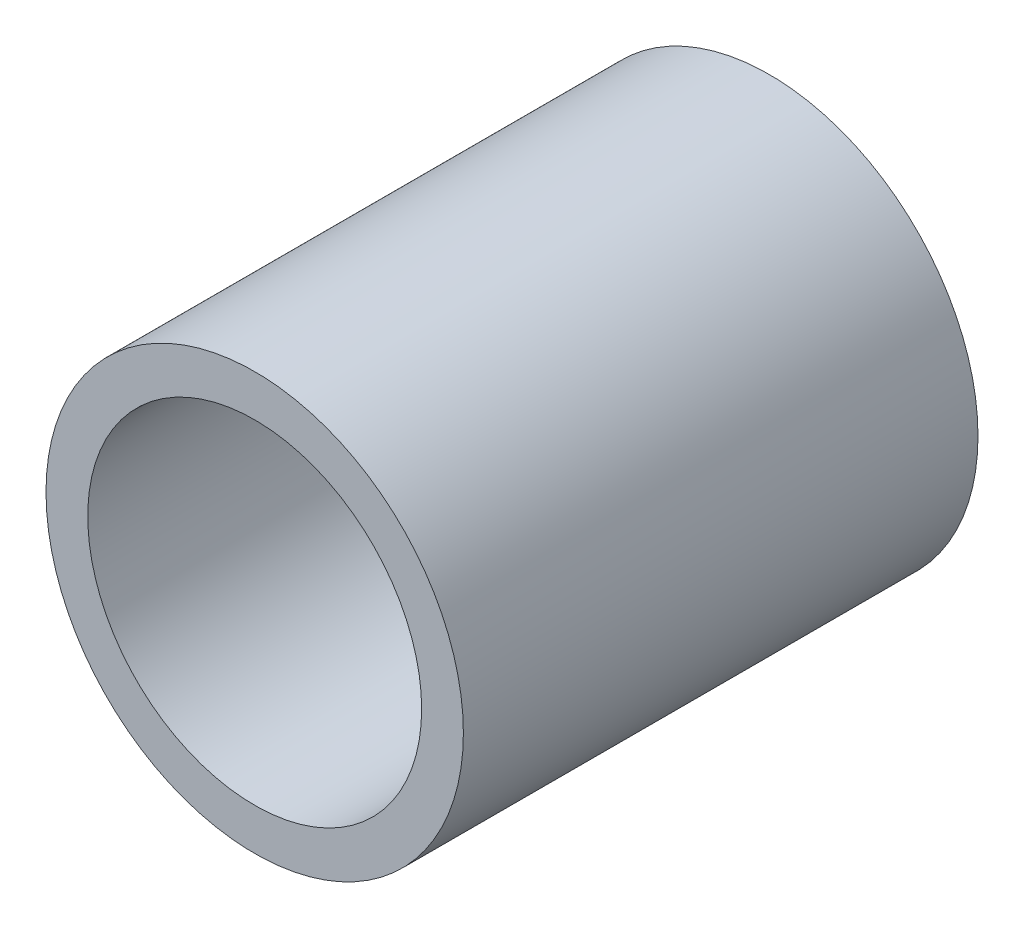
ISO-10303-21;
HEADER;
FILE_DESCRIPTION(('STEP AP214'),'2;1');
FILE_NAME('part.step','',(''),(''),'','','');
FILE_SCHEMA(('AUTOMOTIVE_DESIGN { 1 0 10303 214 1 1 1 1 }'));
ENDSEC;
DATA;
#1=APPLICATION_CONTEXT('core data for automotive mechanical design processes');
#2=APPLICATION_PROTOCOL_DEFINITION('international standard','automotive_design',2000,#1);
#3=PRODUCT_CONTEXT('',#1,'mechanical');
#4=PRODUCT('Part','Part','',(#3));
#5=PRODUCT_RELATED_PRODUCT_CATEGORY('part','',(#4));
#6=PRODUCT_DEFINITION_FORMATION('','',#4);
#7=PRODUCT_DEFINITION_CONTEXT('part definition',#1,'design');
#8=PRODUCT_DEFINITION('design','',#6,#7);
#9=PRODUCT_DEFINITION_SHAPE('','',#8);
#10=(LENGTH_UNIT() NAMED_UNIT(*) SI_UNIT(.MILLI.,.METRE.));
#11=(NAMED_UNIT(*) PLANE_ANGLE_UNIT() SI_UNIT($,.RADIAN.));
#12=(NAMED_UNIT(*) SI_UNIT($,.STERADIAN.) SOLID_ANGLE_UNIT());
#13=UNCERTAINTY_MEASURE_WITH_UNIT(LENGTH_MEASURE(1.E-05),#10,'distance_accuracy_value','');
#14=(GEOMETRIC_REPRESENTATION_CONTEXT(3) GLOBAL_UNCERTAINTY_ASSIGNED_CONTEXT((#13)) GLOBAL_UNIT_ASSIGNED_CONTEXT((#10,
#11,#12)) REPRESENTATION_CONTEXT('',''));
#15=CARTESIAN_POINT('',(0.,0.,0.));
#16=DIRECTION('',(0.,0.,1.));
#17=DIRECTION('',(1.,0.,0.));
#18=AXIS2_PLACEMENT_3D('',#15,#16,#17);
#19=CARTESIAN_POINT('',(0.,0.,9.786423658));
#20=DIRECTION('',(0.,0.,1.));
#21=DIRECTION('',(1.,0.,0.));
#22=AXIS2_PLACEMENT_3D('',#19,#20,#21);
#23=PLANE('',#22);
#24=CARTESIAN_POINT('',(0.,0.,9.786423658));
#25=DIRECTION('',(0.,0.,1.));
#26=DIRECTION('',(1.,0.,0.));
#27=AXIS2_PLACEMENT_3D('',#24,#25,#26);
#28=CIRCLE('',#27,7.9375);
#29=CARTESIAN_POINT('',(7.9375,0.,9.786423658));
#30=VERTEX_POINT('',#29);
#31=EDGE_CURVE('E10',#30,#30,#28,.T.);
#32=ORIENTED_EDGE('',*,*,#31,.T.);
#33=EDGE_LOOP('',(#32));
#34=FACE_BOUND('',#33,.T.);
#35=CARTESIAN_POINT('',(0.,0.,9.786423658));
#36=DIRECTION('',(0.,0.,1.));
#37=DIRECTION('',(1.,0.,0.));
#38=AXIS2_PLACEMENT_3D('',#35,#36,#37);
#39=CIRCLE('',#38,6.35);
#40=CARTESIAN_POINT('',(6.35,0.,9.786423658));
#41=VERTEX_POINT('',#40);
#42=EDGE_CURVE('E44',#41,#41,#39,.T.);
#43=ORIENTED_EDGE('',*,*,#42,.F.);
#44=EDGE_LOOP('',(#43));
#45=FACE_BOUND('',#44,.T.);
#46=ADVANCED_FACE('F33',(#34,#45),#23,.T.);
#47=CARTESIAN_POINT('',(0.,0.,-9.786423658));
#48=DIRECTION('',(0.,0.,1.));
#49=DIRECTION('',(1.,0.,0.));
#50=AXIS2_PLACEMENT_3D('',#47,#48,#49);
#51=PLANE('',#50);
#52=CARTESIAN_POINT('',(0.,0.,-9.786423658));
#53=DIRECTION('',(0.,0.,1.));
#54=DIRECTION('',(1.,0.,0.));
#55=AXIS2_PLACEMENT_3D('',#52,#53,#54);
#56=CIRCLE('',#55,7.9375);
#57=CARTESIAN_POINT('',(7.9375,0.,-9.786423658));
#58=VERTEX_POINT('',#57);
#59=EDGE_CURVE('E37',#58,#58,#56,.T.);
#60=ORIENTED_EDGE('',*,*,#59,.F.);
#61=EDGE_LOOP('',(#60));
#62=FACE_BOUND('',#61,.T.);
#63=CARTESIAN_POINT('',(0.,0.,-9.786423658));
#64=DIRECTION('',(0.,0.,1.));
#65=DIRECTION('',(1.,0.,0.));
#66=AXIS2_PLACEMENT_3D('',#63,#64,#65);
#67=CIRCLE('',#66,6.35);
#68=CARTESIAN_POINT('',(6.35,0.,-9.786423658));
#69=VERTEX_POINT('',#68);
#70=EDGE_CURVE('E46',#69,#69,#67,.T.);
#71=ORIENTED_EDGE('',*,*,#70,.T.);
#72=EDGE_LOOP('',(#71));
#73=FACE_BOUND('',#72,.T.);
#74=ADVANCED_FACE('F56',(#62,#73),#51,.F.);
#75=CARTESIAN_POINT('',(0.,0.,9.786423658));
#76=DIRECTION('',(0.,0.,-1.));
#77=DIRECTION('',(-1.,0.,0.));
#78=AXIS2_PLACEMENT_3D('',#75,#76,#77);
#79=CYLINDRICAL_SURFACE('',#78,7.9375);
#80=ORIENTED_EDGE('',*,*,#31,.F.);
#81=EDGE_LOOP('',(#80));
#82=FACE_BOUND('',#81,.T.);
#83=ORIENTED_EDGE('',*,*,#59,.T.);
#84=EDGE_LOOP('',(#83));
#85=FACE_BOUND('',#84,.T.);
#86=ADVANCED_FACE('F35',(#82,#85),#79,.T.);
#87=CARTESIAN_POINT('',(0.,0.,9.786423658));
#88=DIRECTION('',(0.,0.,-1.));
#89=DIRECTION('',(-1.,0.,0.));
#90=AXIS2_PLACEMENT_3D('',#87,#88,#89);
#91=CYLINDRICAL_SURFACE('',#90,6.35);
#92=ORIENTED_EDGE('',*,*,#42,.T.);
#93=EDGE_LOOP('',(#92));
#94=FACE_BOUND('',#93,.T.);
#95=ORIENTED_EDGE('',*,*,#70,.F.);
#96=EDGE_LOOP('',(#95));
#97=FACE_BOUND('',#96,.T.);
#98=ADVANCED_FACE('F52',(#94,#97),#91,.F.);
#99=CLOSED_SHELL('',(#46,#74,#86,#98));
#100=MANIFOLD_SOLID_BREP('B2',#99);
#101=ADVANCED_BREP_SHAPE_REPRESENTATION('',(#18,#100),#14);
#102=SHAPE_DEFINITION_REPRESENTATION(#9,#101);
ENDSEC;
END-ISO-10303-21;
